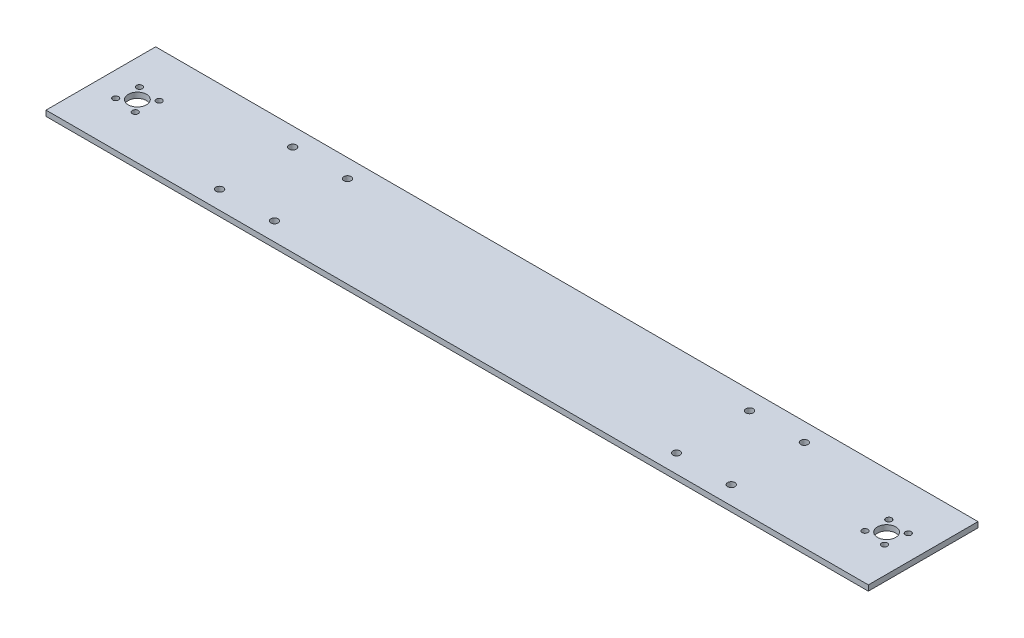
ISO-10303-21;
HEADER;
FILE_DESCRIPTION(('STEP AP214'),'2;1');
FILE_NAME('part.step','',(''),(''),'','','');
FILE_SCHEMA(('AUTOMOTIVE_DESIGN { 1 0 10303 214 1 1 1 1 }'));
ENDSEC;
DATA;
#1=APPLICATION_CONTEXT('core data for automotive mechanical design processes');
#2=APPLICATION_PROTOCOL_DEFINITION('international standard','automotive_design',2000,#1);
#3=PRODUCT_CONTEXT('',#1,'mechanical');
#4=PRODUCT('Part','Part','',(#3));
#5=PRODUCT_RELATED_PRODUCT_CATEGORY('part','',(#4));
#6=PRODUCT_DEFINITION_FORMATION('','',#4);
#7=PRODUCT_DEFINITION_CONTEXT('part definition',#1,'design');
#8=PRODUCT_DEFINITION('design','',#6,#7);
#9=PRODUCT_DEFINITION_SHAPE('','',#8);
#10=(LENGTH_UNIT() NAMED_UNIT(*) SI_UNIT(.MILLI.,.METRE.));
#11=(NAMED_UNIT(*) PLANE_ANGLE_UNIT() SI_UNIT($,.RADIAN.));
#12=(NAMED_UNIT(*) SI_UNIT($,.STERADIAN.) SOLID_ANGLE_UNIT());
#13=UNCERTAINTY_MEASURE_WITH_UNIT(LENGTH_MEASURE(1.E-05),#10,'distance_accuracy_value','');
#14=(GEOMETRIC_REPRESENTATION_CONTEXT(3) GLOBAL_UNCERTAINTY_ASSIGNED_CONTEXT((#13)) GLOBAL_UNIT_ASSIGNED_CONTEXT((#10,
#11,#12)) REPRESENTATION_CONTEXT('',''));
#15=CARTESIAN_POINT('',(0.,0.,0.));
#16=DIRECTION('',(0.,0.,1.));
#17=DIRECTION('',(1.,0.,0.));
#18=AXIS2_PLACEMENT_3D('',#15,#16,#17);
#19=CARTESIAN_POINT('',(0.,3.,0.));
#20=DIRECTION('',(-1.,0.,0.));
#21=DIRECTION('',(0.,0.,1.));
#22=AXIS2_PLACEMENT_3D('',#19,#20,#21);
#23=PLANE('',#22);
#24=DIRECTION('',(0.,0.,-1.));
#25=VECTOR('',#24,1.);
#26=CARTESIAN_POINT('',(0.,0.,0.));
#27=LINE('',#26,#25);
#28=CARTESIAN_POINT('',(0.,0.,0.));
#29=VERTEX_POINT('',#28);
#30=CARTESIAN_POINT('',(0.,0.,-60.));
#31=VERTEX_POINT('',#30);
#32=EDGE_CURVE('E109',#29,#31,#27,.T.);
#33=ORIENTED_EDGE('',*,*,#32,.T.);
#34=DIRECTION('',(0.,-1.,0.));
#35=VECTOR('',#34,1.);
#36=CARTESIAN_POINT('',(0.,3.,-60.));
#37=LINE('',#36,#35);
#38=CARTESIAN_POINT('',(0.,3.,-60.));
#39=VERTEX_POINT('',#38);
#40=EDGE_CURVE('E11',#39,#31,#37,.T.);
#41=ORIENTED_EDGE('',*,*,#40,.F.);
#42=DIRECTION('',(0.,0.,-1.));
#43=VECTOR('',#42,1.);
#44=CARTESIAN_POINT('',(0.,3.,0.));
#45=LINE('',#44,#43);
#46=CARTESIAN_POINT('',(0.,3.,0.));
#47=VERTEX_POINT('',#46);
#48=EDGE_CURVE('E96',#47,#39,#45,.T.);
#49=ORIENTED_EDGE('',*,*,#48,.F.);
#50=DIRECTION('',(0.,-1.,0.));
#51=VECTOR('',#50,1.);
#52=CARTESIAN_POINT('',(0.,3.,0.));
#53=LINE('',#52,#51);
#54=EDGE_CURVE('E105',#47,#29,#53,.T.);
#55=ORIENTED_EDGE('',*,*,#54,.T.);
#56=EDGE_LOOP('',(#33,#41,#49,#55));
#57=FACE_BOUND('',#56,.T.);
#58=ADVANCED_FACE('F43',(#57),#23,.F.);
#59=CARTESIAN_POINT('',(0.,3.,-60.));
#60=DIRECTION('',(0.,0.,1.));
#61=DIRECTION('',(1.,0.,0.));
#62=AXIS2_PLACEMENT_3D('',#59,#60,#61);
#63=PLANE('',#62);
#64=DIRECTION('',(-1.,0.,0.));
#65=VECTOR('',#64,1.);
#66=CARTESIAN_POINT('',(0.,0.,-60.));
#67=LINE('',#66,#65);
#68=CARTESIAN_POINT('',(-450.,0.,-60.));
#69=VERTEX_POINT('',#68);
#70=EDGE_CURVE('E100',#31,#69,#67,.T.);
#71=ORIENTED_EDGE('',*,*,#70,.T.);
#72=DIRECTION('',(0.,-1.,0.));
#73=VECTOR('',#72,1.);
#74=CARTESIAN_POINT('',(-450.,3.,-60.));
#75=LINE('',#74,#73);
#76=CARTESIAN_POINT('',(-450.,3.,-60.));
#77=VERTEX_POINT('',#76);
#78=EDGE_CURVE('E52',#77,#69,#75,.T.);
#79=ORIENTED_EDGE('',*,*,#78,.F.);
#80=DIRECTION('',(-1.,0.,0.));
#81=VECTOR('',#80,1.);
#82=CARTESIAN_POINT('',(0.,3.,-60.));
#83=LINE('',#82,#81);
#84=EDGE_CURVE('E91',#39,#77,#83,.T.);
#85=ORIENTED_EDGE('',*,*,#84,.F.);
#86=ORIENTED_EDGE('',*,*,#40,.T.);
#87=EDGE_LOOP('',(#71,#79,#85,#86));
#88=FACE_BOUND('',#87,.T.);
#89=ADVANCED_FACE('F99',(#88),#63,.F.);
#90=CARTESIAN_POINT('',(-450.,3.,0.));
#91=DIRECTION('',(1.,0.,0.));
#92=DIRECTION('',(0.,0.,-1.));
#93=AXIS2_PLACEMENT_3D('',#90,#91,#92);
#94=PLANE('',#93);
#95=DIRECTION('',(0.,0.,1.));
#96=VECTOR('',#95,1.);
#97=CARTESIAN_POINT('',(-450.,0.,0.));
#98=LINE('',#97,#96);
#99=CARTESIAN_POINT('',(-450.,0.,0.));
#100=VERTEX_POINT('',#99);
#101=EDGE_CURVE('E78',#69,#100,#98,.T.);
#102=ORIENTED_EDGE('',*,*,#101,.T.);
#103=DIRECTION('',(0.,-1.,0.));
#104=VECTOR('',#103,1.);
#105=CARTESIAN_POINT('',(-450.,3.,0.));
#106=LINE('',#105,#104);
#107=CARTESIAN_POINT('',(-450.,3.,0.));
#108=VERTEX_POINT('',#107);
#109=EDGE_CURVE('E101',#108,#100,#106,.T.);
#110=ORIENTED_EDGE('',*,*,#109,.F.);
#111=DIRECTION('',(0.,0.,1.));
#112=VECTOR('',#111,1.);
#113=CARTESIAN_POINT('',(-450.,3.,0.));
#114=LINE('',#113,#112);
#115=EDGE_CURVE('E94',#77,#108,#114,.T.);
#116=ORIENTED_EDGE('',*,*,#115,.F.);
#117=ORIENTED_EDGE('',*,*,#78,.T.);
#118=EDGE_LOOP('',(#102,#110,#116,#117));
#119=FACE_BOUND('',#118,.T.);
#120=ADVANCED_FACE('F103',(#119),#94,.F.);
#121=CARTESIAN_POINT('',(0.,3.,0.));
#122=DIRECTION('',(0.,0.,-1.));
#123=DIRECTION('',(-1.,0.,0.));
#124=AXIS2_PLACEMENT_3D('',#121,#122,#123);
#125=PLANE('',#124);
#126=DIRECTION('',(1.,0.,0.));
#127=VECTOR('',#126,1.);
#128=CARTESIAN_POINT('',(0.,0.,0.));
#129=LINE('',#128,#127);
#130=EDGE_CURVE('E84',#100,#29,#129,.T.);
#131=ORIENTED_EDGE('',*,*,#130,.T.);
#132=ORIENTED_EDGE('',*,*,#54,.F.);
#133=DIRECTION('',(1.,0.,0.));
#134=VECTOR('',#133,1.);
#135=CARTESIAN_POINT('',(0.,3.,0.));
#136=LINE('',#135,#134);
#137=EDGE_CURVE('E61',#108,#47,#136,.T.);
#138=ORIENTED_EDGE('',*,*,#137,.F.);
#139=ORIENTED_EDGE('',*,*,#109,.T.);
#140=EDGE_LOOP('',(#131,#132,#138,#139));
#141=FACE_BOUND('',#140,.T.);
#142=ADVANCED_FACE('F220',(#141),#125,.F.);
#143=CARTESIAN_POINT('',(0.,3.,0.));
#144=DIRECTION('',(0.,1.,0.));
#145=DIRECTION('',(0.,0.,1.));
#146=AXIS2_PLACEMENT_3D('',#143,#144,#145);
#147=PLANE('',#146);
#148=CARTESIAN_POINT('',(-25.3457226439257,3.,-36.5549777485414));
#149=DIRECTION('',(0.,1.,0.));
#150=DIRECTION('',(0.,0.,1.));
#151=AXIS2_PLACEMENT_3D('',#148,#149,#150);
#152=CIRCLE('',#151,1.6);
#153=CARTESIAN_POINT('',(-25.3457226439257,3.,-34.9549777485414));
#154=VERTEX_POINT('',#153);
#155=EDGE_CURVE('E436',#154,#154,#152,.T.);
#156=ORIENTED_EDGE('',*,*,#155,.F.);
#157=EDGE_LOOP('',(#156));
#158=FACE_BOUND('',#157,.T.);
#159=CARTESIAN_POINT('',(-26.5109179084313,3.,-24.6436634580579));
#160=DIRECTION('',(0.,1.,0.));
#161=DIRECTION('',(0.,0.,1.));
#162=AXIS2_PLACEMENT_3D('',#159,#160,#161);
#163=CIRCLE('',#162,1.59999999999998);
#164=CARTESIAN_POINT('',(-26.5109179084313,3.,-23.0436634580579));
#165=VERTEX_POINT('',#164);
#166=EDGE_CURVE('E437',#165,#165,#163,.T.);
#167=ORIENTED_EDGE('',*,*,#166,.F.);
#168=EDGE_LOOP('',(#167));
#169=FACE_BOUND('',#168,.T.);
#170=CARTESIAN_POINT('',(-14.6436634580576,3.,-23.4890820915691));
#171=DIRECTION('',(0.,1.,0.));
#172=DIRECTION('',(0.,0.,1.));
#173=AXIS2_PLACEMENT_3D('',#170,#171,#172);
#174=CIRCLE('',#173,1.6);
#175=CARTESIAN_POINT('',(-14.6436634580576,3.,-21.8890820915691));
#176=VERTEX_POINT('',#175);
#177=EDGE_CURVE('E440',#176,#176,#174,.T.);
#178=ORIENTED_EDGE('',*,*,#177,.F.);
#179=EDGE_LOOP('',(#178));
#180=FACE_BOUND('',#179,.T.);
#181=CARTESIAN_POINT('',(-13.489082091569,3.,-35.3563365419424));
#182=DIRECTION('',(0.,1.,0.));
#183=DIRECTION('',(0.,0.,1.));
#184=AXIS2_PLACEMENT_3D('',#181,#182,#183);
#185=CIRCLE('',#184,1.6);
#186=CARTESIAN_POINT('',(-13.489082091569,3.,-33.7563365419424));
#187=VERTEX_POINT('',#186);
#188=EDGE_CURVE('E130',#187,#187,#185,.T.);
#189=ORIENTED_EDGE('',*,*,#188,.F.);
#190=EDGE_LOOP('',(#189));
#191=FACE_BOUND('',#190,.T.);
#192=CARTESIAN_POINT('',(-423.489082091569,3.,-35.3563365419422));
#193=DIRECTION('',(0.,1.,0.));
#194=DIRECTION('',(0.,0.,1.));
#195=AXIS2_PLACEMENT_3D('',#192,#193,#194);
#196=CIRCLE('',#195,1.59999999999996);
#197=CARTESIAN_POINT('',(-423.489082091569,3.,-33.7563365419422));
#198=VERTEX_POINT('',#197);
#199=EDGE_CURVE('E137',#198,#198,#196,.T.);
#200=ORIENTED_EDGE('',*,*,#199,.F.);
#201=EDGE_LOOP('',(#200));
#202=FACE_BOUND('',#201,.T.);
#203=CARTESIAN_POINT('',(-424.643663458058,3.,-23.489082091569));
#204=DIRECTION('',(0.,1.,0.));
#205=DIRECTION('',(0.,0.,1.));
#206=AXIS2_PLACEMENT_3D('',#203,#204,#205);
#207=CIRCLE('',#206,1.60000000000002);
#208=CARTESIAN_POINT('',(-424.643663458058,3.,-21.8890820915689));
#209=VERTEX_POINT('',#208);
#210=EDGE_CURVE('E146',#209,#209,#207,.T.);
#211=ORIENTED_EDGE('',*,*,#210,.F.);
#212=EDGE_LOOP('',(#211));
#213=FACE_BOUND('',#212,.T.);
#214=CARTESIAN_POINT('',(-436.510917908431,3.,-24.6436634580576));
#215=DIRECTION('',(0.,1.,0.));
#216=DIRECTION('',(0.,0.,1.));
#217=AXIS2_PLACEMENT_3D('',#214,#215,#216);
#218=CIRCLE('',#217,1.60000000000002);
#219=CARTESIAN_POINT('',(-436.510917908431,3.,-23.0436634580576));
#220=VERTEX_POINT('',#219);
#221=EDGE_CURVE('E448',#220,#220,#218,.T.);
#222=ORIENTED_EDGE('',*,*,#221,.F.);
#223=EDGE_LOOP('',(#222));
#224=FACE_BOUND('',#223,.T.);
#225=CARTESIAN_POINT('',(-435.356336541942,3.,-36.510917908431));
#226=DIRECTION('',(0.,1.,0.));
#227=DIRECTION('',(0.,0.,1.));
#228=AXIS2_PLACEMENT_3D('',#225,#226,#227);
#229=CIRCLE('',#228,1.59999999999996);
#230=CARTESIAN_POINT('',(-435.356336541942,3.,-34.910917908431));
#231=VERTEX_POINT('',#230);
#232=EDGE_CURVE('E154',#231,#231,#229,.T.);
#233=ORIENTED_EDGE('',*,*,#232,.F.);
#234=EDGE_LOOP('',(#233));
#235=FACE_BOUND('',#234,.T.);
#236=CARTESIAN_POINT('',(-20.,3.,-30.));
#237=DIRECTION('',(0.,1.,0.));
#238=DIRECTION('',(0.,0.,1.));
#239=AXIS2_PLACEMENT_3D('',#236,#237,#238);
#240=CIRCLE('',#239,5.);
#241=CARTESIAN_POINT('',(-20.,3.,-25.));
#242=VERTEX_POINT('',#241);
#243=EDGE_CURVE('E122',#242,#242,#240,.T.);
#244=ORIENTED_EDGE('',*,*,#243,.F.);
#245=EDGE_LOOP('',(#244));
#246=FACE_BOUND('',#245,.T.);
#247=CARTESIAN_POINT('',(-430.,3.,-30.));
#248=DIRECTION('',(0.,1.,0.));
#249=DIRECTION('',(0.,0.,1.));
#250=AXIS2_PLACEMENT_3D('',#247,#248,#249);
#251=CIRCLE('',#250,4.99999999999999);
#252=CARTESIAN_POINT('',(-430.,3.,-25.));
#253=VERTEX_POINT('',#252);
#254=EDGE_CURVE('E153',#253,#253,#251,.T.);
#255=ORIENTED_EDGE('',*,*,#254,.F.);
#256=EDGE_LOOP('',(#255));
#257=FACE_BOUND('',#256,.T.);
#258=CARTESIAN_POINT('',(-365.,3.,-50.));
#259=DIRECTION('',(0.,1.,0.));
#260=DIRECTION('',(0.,0.,1.));
#261=AXIS2_PLACEMENT_3D('',#258,#259,#260);
#262=CIRCLE('',#261,2.);
#263=CARTESIAN_POINT('',(-365.,3.,-48.));
#264=VERTEX_POINT('',#263);
#265=EDGE_CURVE('E125',#264,#264,#262,.T.);
#266=ORIENTED_EDGE('',*,*,#265,.F.);
#267=EDGE_LOOP('',(#266));
#268=FACE_BOUND('',#267,.T.);
#269=CARTESIAN_POINT('',(-335.,3.,-50.));
#270=DIRECTION('',(0.,1.,0.));
#271=DIRECTION('',(0.,0.,1.));
#272=AXIS2_PLACEMENT_3D('',#269,#270,#271);
#273=CIRCLE('',#272,2.);
#274=CARTESIAN_POINT('',(-335.,3.,-48.));
#275=VERTEX_POINT('',#274);
#276=EDGE_CURVE('E167',#275,#275,#273,.T.);
#277=ORIENTED_EDGE('',*,*,#276,.F.);
#278=EDGE_LOOP('',(#277));
#279=FACE_BOUND('',#278,.T.);
#280=CARTESIAN_POINT('',(-365.,3.,-9.99999999999995));
#281=DIRECTION('',(0.,1.,0.));
#282=DIRECTION('',(0.,0.,1.));
#283=AXIS2_PLACEMENT_3D('',#280,#281,#282);
#284=CIRCLE('',#283,2.);
#285=CARTESIAN_POINT('',(-365.,3.,-7.99999999999995));
#286=VERTEX_POINT('',#285);
#287=EDGE_CURVE('E173',#286,#286,#284,.T.);
#288=ORIENTED_EDGE('',*,*,#287,.F.);
#289=EDGE_LOOP('',(#288));
#290=FACE_BOUND('',#289,.T.);
#291=CARTESIAN_POINT('',(-335.,3.,-9.99999999999995));
#292=DIRECTION('',(0.,1.,0.));
#293=DIRECTION('',(0.,0.,1.));
#294=AXIS2_PLACEMENT_3D('',#291,#292,#293);
#295=CIRCLE('',#294,2.);
#296=CARTESIAN_POINT('',(-335.,3.,-7.99999999999995));
#297=VERTEX_POINT('',#296);
#298=EDGE_CURVE('E179',#297,#297,#295,.T.);
#299=ORIENTED_EDGE('',*,*,#298,.F.);
#300=EDGE_LOOP('',(#299));
#301=FACE_BOUND('',#300,.T.);
#302=CARTESIAN_POINT('',(-115.,3.,-50.));
#303=DIRECTION('',(0.,1.,0.));
#304=DIRECTION('',(0.,0.,1.));
#305=AXIS2_PLACEMENT_3D('',#302,#303,#304);
#306=CIRCLE('',#305,1.99999999999999);
#307=CARTESIAN_POINT('',(-115.,3.,-48.));
#308=VERTEX_POINT('',#307);
#309=EDGE_CURVE('E185',#308,#308,#306,.T.);
#310=ORIENTED_EDGE('',*,*,#309,.F.);
#311=EDGE_LOOP('',(#310));
#312=FACE_BOUND('',#311,.T.);
#313=CARTESIAN_POINT('',(-85.,3.,-50.));
#314=DIRECTION('',(0.,1.,0.));
#315=DIRECTION('',(0.,0.,1.));
#316=AXIS2_PLACEMENT_3D('',#313,#314,#315);
#317=CIRCLE('',#316,1.99999999999999);
#318=CARTESIAN_POINT('',(-85.,3.,-48.));
#319=VERTEX_POINT('',#318);
#320=EDGE_CURVE('E191',#319,#319,#317,.T.);
#321=ORIENTED_EDGE('',*,*,#320,.F.);
#322=EDGE_LOOP('',(#321));
#323=FACE_BOUND('',#322,.T.);
#324=CARTESIAN_POINT('',(-115.,3.,-9.99999999999995));
#325=DIRECTION('',(0.,1.,0.));
#326=DIRECTION('',(0.,0.,1.));
#327=AXIS2_PLACEMENT_3D('',#324,#325,#326);
#328=CIRCLE('',#327,1.99999999999999);
#329=CARTESIAN_POINT('',(-115.,3.,-7.99999999999996));
#330=VERTEX_POINT('',#329);
#331=EDGE_CURVE('E197',#330,#330,#328,.T.);
#332=ORIENTED_EDGE('',*,*,#331,.F.);
#333=EDGE_LOOP('',(#332));
#334=FACE_BOUND('',#333,.T.);
#335=CARTESIAN_POINT('',(-85.,3.,-9.99999999999995));
#336=DIRECTION('',(0.,1.,0.));
#337=DIRECTION('',(0.,0.,1.));
#338=AXIS2_PLACEMENT_3D('',#335,#336,#337);
#339=CIRCLE('',#338,1.99999999999999);
#340=CARTESIAN_POINT('',(-85.,3.,-7.99999999999996));
#341=VERTEX_POINT('',#340);
#342=EDGE_CURVE('E203',#341,#341,#339,.T.);
#343=ORIENTED_EDGE('',*,*,#342,.F.);
#344=EDGE_LOOP('',(#343));
#345=FACE_BOUND('',#344,.T.);
#346=ORIENTED_EDGE('',*,*,#48,.T.);
#347=ORIENTED_EDGE('',*,*,#84,.T.);
#348=ORIENTED_EDGE('',*,*,#115,.T.);
#349=ORIENTED_EDGE('',*,*,#137,.T.);
#350=EDGE_LOOP('',(#346,#347,#348,#349));
#351=FACE_BOUND('',#350,.T.);
#352=ADVANCED_FACE('F92',(#158,#169,#180,#191,#202,#213,#224,#235,#246,#257,#268,#279,#290,#301,
#312,#323,#334,#345,#351),#147,.T.);
#353=CARTESIAN_POINT('',(0.,0.,0.));
#354=DIRECTION('',(0.,1.,0.));
#355=DIRECTION('',(0.,0.,1.));
#356=AXIS2_PLACEMENT_3D('',#353,#354,#355);
#357=PLANE('',#356);
#358=CARTESIAN_POINT('',(-25.3457226439257,0.,-36.5549777485414));
#359=DIRECTION('',(0.,1.,0.));
#360=DIRECTION('',(0.,0.,1.));
#361=AXIS2_PLACEMENT_3D('',#358,#359,#360);
#362=CIRCLE('',#361,1.6);
#363=CARTESIAN_POINT('',(-25.3457226439257,0.,-34.9549777485414));
#364=VERTEX_POINT('',#363);
#365=EDGE_CURVE('E46',#364,#364,#362,.T.);
#366=ORIENTED_EDGE('',*,*,#365,.T.);
#367=EDGE_LOOP('',(#366));
#368=FACE_BOUND('',#367,.T.);
#369=CARTESIAN_POINT('',(-26.5109179084313,0.,-24.6436634580579));
#370=DIRECTION('',(0.,1.,0.));
#371=DIRECTION('',(0.,0.,1.));
#372=AXIS2_PLACEMENT_3D('',#369,#370,#371);
#373=CIRCLE('',#372,1.59999999999998);
#374=CARTESIAN_POINT('',(-26.5109179084313,0.,-23.0436634580579));
#375=VERTEX_POINT('',#374);
#376=EDGE_CURVE('E132',#375,#375,#373,.T.);
#377=ORIENTED_EDGE('',*,*,#376,.T.);
#378=EDGE_LOOP('',(#377));
#379=FACE_BOUND('',#378,.T.);
#380=CARTESIAN_POINT('',(-14.6436634580576,0.,-23.4890820915691));
#381=DIRECTION('',(0.,1.,0.));
#382=DIRECTION('',(0.,0.,1.));
#383=AXIS2_PLACEMENT_3D('',#380,#381,#382);
#384=CIRCLE('',#383,1.6);
#385=CARTESIAN_POINT('',(-14.6436634580576,0.,-21.8890820915691));
#386=VERTEX_POINT('',#385);
#387=EDGE_CURVE('E129',#386,#386,#384,.T.);
#388=ORIENTED_EDGE('',*,*,#387,.T.);
#389=EDGE_LOOP('',(#388));
#390=FACE_BOUND('',#389,.T.);
#391=CARTESIAN_POINT('',(-13.489082091569,0.,-35.3563365419424));
#392=DIRECTION('',(0.,1.,0.));
#393=DIRECTION('',(0.,0.,1.));
#394=AXIS2_PLACEMENT_3D('',#391,#392,#393);
#395=CIRCLE('',#394,1.6);
#396=CARTESIAN_POINT('',(-13.489082091569,0.,-33.7563365419424));
#397=VERTEX_POINT('',#396);
#398=EDGE_CURVE('E126',#397,#397,#395,.T.);
#399=ORIENTED_EDGE('',*,*,#398,.T.);
#400=EDGE_LOOP('',(#399));
#401=FACE_BOUND('',#400,.T.);
#402=CARTESIAN_POINT('',(-423.489082091569,0.,-35.3563365419422));
#403=DIRECTION('',(0.,1.,0.));
#404=DIRECTION('',(0.,0.,1.));
#405=AXIS2_PLACEMENT_3D('',#402,#403,#404);
#406=CIRCLE('',#405,1.59999999999996);
#407=CARTESIAN_POINT('',(-423.489082091569,0.,-33.7563365419422));
#408=VERTEX_POINT('',#407);
#409=EDGE_CURVE('E141',#408,#408,#406,.T.);
#410=ORIENTED_EDGE('',*,*,#409,.T.);
#411=EDGE_LOOP('',(#410));
#412=FACE_BOUND('',#411,.T.);
#413=CARTESIAN_POINT('',(-424.643663458058,0.,-23.489082091569));
#414=DIRECTION('',(0.,1.,0.));
#415=DIRECTION('',(0.,0.,1.));
#416=AXIS2_PLACEMENT_3D('',#413,#414,#415);
#417=CIRCLE('',#416,1.60000000000002);
#418=CARTESIAN_POINT('',(-424.643663458058,0.,-21.8890820915689));
#419=VERTEX_POINT('',#418);
#420=EDGE_CURVE('E451',#419,#419,#417,.T.);
#421=ORIENTED_EDGE('',*,*,#420,.T.);
#422=EDGE_LOOP('',(#421));
#423=FACE_BOUND('',#422,.T.);
#424=CARTESIAN_POINT('',(-436.510917908431,0.,-24.6436634580576));
#425=DIRECTION('',(0.,1.,0.));
#426=DIRECTION('',(0.,0.,1.));
#427=AXIS2_PLACEMENT_3D('',#424,#425,#426);
#428=CIRCLE('',#427,1.60000000000002);
#429=CARTESIAN_POINT('',(-436.510917908431,0.,-23.0436634580576));
#430=VERTEX_POINT('',#429);
#431=EDGE_CURVE('E157',#430,#430,#428,.T.);
#432=ORIENTED_EDGE('',*,*,#431,.T.);
#433=EDGE_LOOP('',(#432));
#434=FACE_BOUND('',#433,.T.);
#435=CARTESIAN_POINT('',(-435.356336541942,0.,-36.510917908431));
#436=DIRECTION('',(0.,1.,0.));
#437=DIRECTION('',(0.,0.,1.));
#438=AXIS2_PLACEMENT_3D('',#435,#436,#437);
#439=CIRCLE('',#438,1.59999999999996);
#440=CARTESIAN_POINT('',(-435.356336541942,0.,-34.910917908431));
#441=VERTEX_POINT('',#440);
#442=EDGE_CURVE('E150',#441,#441,#439,.T.);
#443=ORIENTED_EDGE('',*,*,#442,.T.);
#444=EDGE_LOOP('',(#443));
#445=FACE_BOUND('',#444,.T.);
#446=CARTESIAN_POINT('',(-20.,0.,-30.));
#447=DIRECTION('',(0.,1.,0.));
#448=DIRECTION('',(0.,0.,1.));
#449=AXIS2_PLACEMENT_3D('',#446,#447,#448);
#450=CIRCLE('',#449,5.);
#451=CARTESIAN_POINT('',(-20.,0.,-25.));
#452=VERTEX_POINT('',#451);
#453=EDGE_CURVE('E121',#452,#452,#450,.T.);
#454=ORIENTED_EDGE('',*,*,#453,.T.);
#455=EDGE_LOOP('',(#454));
#456=FACE_BOUND('',#455,.T.);
#457=CARTESIAN_POINT('',(-430.,0.,-30.));
#458=DIRECTION('',(0.,1.,0.));
#459=DIRECTION('',(0.,0.,1.));
#460=AXIS2_PLACEMENT_3D('',#457,#458,#459);
#461=CIRCLE('',#460,4.99999999999999);
#462=CARTESIAN_POINT('',(-430.,0.,-25.));
#463=VERTEX_POINT('',#462);
#464=EDGE_CURVE('E118',#463,#463,#461,.T.);
#465=ORIENTED_EDGE('',*,*,#464,.T.);
#466=EDGE_LOOP('',(#465));
#467=FACE_BOUND('',#466,.T.);
#468=CARTESIAN_POINT('',(-365.,0.,-50.));
#469=DIRECTION('',(0.,1.,0.));
#470=DIRECTION('',(0.,0.,1.));
#471=AXIS2_PLACEMENT_3D('',#468,#469,#470);
#472=CIRCLE('',#471,2.);
#473=CARTESIAN_POINT('',(-365.,0.,-48.));
#474=VERTEX_POINT('',#473);
#475=EDGE_CURVE('E164',#474,#474,#472,.T.);
#476=ORIENTED_EDGE('',*,*,#475,.T.);
#477=EDGE_LOOP('',(#476));
#478=FACE_BOUND('',#477,.T.);
#479=CARTESIAN_POINT('',(-335.,0.,-50.));
#480=DIRECTION('',(0.,1.,0.));
#481=DIRECTION('',(0.,0.,1.));
#482=AXIS2_PLACEMENT_3D('',#479,#480,#481);
#483=CIRCLE('',#482,2.);
#484=CARTESIAN_POINT('',(-335.,0.,-48.));
#485=VERTEX_POINT('',#484);
#486=EDGE_CURVE('E170',#485,#485,#483,.T.);
#487=ORIENTED_EDGE('',*,*,#486,.T.);
#488=EDGE_LOOP('',(#487));
#489=FACE_BOUND('',#488,.T.);
#490=CARTESIAN_POINT('',(-365.,0.,-9.99999999999995));
#491=DIRECTION('',(0.,1.,0.));
#492=DIRECTION('',(0.,0.,1.));
#493=AXIS2_PLACEMENT_3D('',#490,#491,#492);
#494=CIRCLE('',#493,2.);
#495=CARTESIAN_POINT('',(-365.,0.,-7.99999999999995));
#496=VERTEX_POINT('',#495);
#497=EDGE_CURVE('E176',#496,#496,#494,.T.);
#498=ORIENTED_EDGE('',*,*,#497,.T.);
#499=EDGE_LOOP('',(#498));
#500=FACE_BOUND('',#499,.T.);
#501=CARTESIAN_POINT('',(-335.,0.,-9.99999999999995));
#502=DIRECTION('',(0.,1.,0.));
#503=DIRECTION('',(0.,0.,1.));
#504=AXIS2_PLACEMENT_3D('',#501,#502,#503);
#505=CIRCLE('',#504,2.);
#506=CARTESIAN_POINT('',(-335.,0.,-7.99999999999995));
#507=VERTEX_POINT('',#506);
#508=EDGE_CURVE('E182',#507,#507,#505,.T.);
#509=ORIENTED_EDGE('',*,*,#508,.T.);
#510=EDGE_LOOP('',(#509));
#511=FACE_BOUND('',#510,.T.);
#512=CARTESIAN_POINT('',(-115.,0.,-50.));
#513=DIRECTION('',(0.,1.,0.));
#514=DIRECTION('',(0.,0.,1.));
#515=AXIS2_PLACEMENT_3D('',#512,#513,#514);
#516=CIRCLE('',#515,1.99999999999999);
#517=CARTESIAN_POINT('',(-115.,0.,-48.));
#518=VERTEX_POINT('',#517);
#519=EDGE_CURVE('E188',#518,#518,#516,.T.);
#520=ORIENTED_EDGE('',*,*,#519,.T.);
#521=EDGE_LOOP('',(#520));
#522=FACE_BOUND('',#521,.T.);
#523=CARTESIAN_POINT('',(-85.,0.,-50.));
#524=DIRECTION('',(0.,1.,0.));
#525=DIRECTION('',(0.,0.,1.));
#526=AXIS2_PLACEMENT_3D('',#523,#524,#525);
#527=CIRCLE('',#526,1.99999999999999);
#528=CARTESIAN_POINT('',(-85.,0.,-48.));
#529=VERTEX_POINT('',#528);
#530=EDGE_CURVE('E194',#529,#529,#527,.T.);
#531=ORIENTED_EDGE('',*,*,#530,.T.);
#532=EDGE_LOOP('',(#531));
#533=FACE_BOUND('',#532,.T.);
#534=CARTESIAN_POINT('',(-115.,0.,-9.99999999999995));
#535=DIRECTION('',(0.,1.,0.));
#536=DIRECTION('',(0.,0.,1.));
#537=AXIS2_PLACEMENT_3D('',#534,#535,#536);
#538=CIRCLE('',#537,1.99999999999999);
#539=CARTESIAN_POINT('',(-115.,0.,-7.99999999999996));
#540=VERTEX_POINT('',#539);
#541=EDGE_CURVE('E200',#540,#540,#538,.T.);
#542=ORIENTED_EDGE('',*,*,#541,.T.);
#543=EDGE_LOOP('',(#542));
#544=FACE_BOUND('',#543,.T.);
#545=CARTESIAN_POINT('',(-85.,0.,-9.99999999999995));
#546=DIRECTION('',(0.,1.,0.));
#547=DIRECTION('',(0.,0.,1.));
#548=AXIS2_PLACEMENT_3D('',#545,#546,#547);
#549=CIRCLE('',#548,1.99999999999999);
#550=CARTESIAN_POINT('',(-85.,0.,-7.99999999999996));
#551=VERTEX_POINT('',#550);
#552=EDGE_CURVE('E112',#551,#551,#549,.T.);
#553=ORIENTED_EDGE('',*,*,#552,.T.);
#554=EDGE_LOOP('',(#553));
#555=FACE_BOUND('',#554,.T.);
#556=ORIENTED_EDGE('',*,*,#32,.F.);
#557=ORIENTED_EDGE('',*,*,#130,.F.);
#558=ORIENTED_EDGE('',*,*,#101,.F.);
#559=ORIENTED_EDGE('',*,*,#70,.F.);
#560=EDGE_LOOP('',(#556,#557,#558,#559));
#561=FACE_BOUND('',#560,.T.);
#562=ADVANCED_FACE('F209',(#368,#379,#390,#401,#412,#423,#434,#445,#456,#467,#478,#489,#500,
#511,#522,#533,#544,#555,#561),#357,.F.);
#563=CARTESIAN_POINT('',(-85.,3.,-9.99999999999995));
#564=DIRECTION('',(0.,1.,0.));
#565=DIRECTION('',(0.,0.,1.));
#566=AXIS2_PLACEMENT_3D('',#563,#564,#565);
#567=CYLINDRICAL_SURFACE('',#566,1.99999999999999);
#568=ORIENTED_EDGE('',*,*,#552,.F.);
#569=EDGE_LOOP('',(#568));
#570=FACE_BOUND('',#569,.T.);
#571=ORIENTED_EDGE('',*,*,#342,.T.);
#572=EDGE_LOOP('',(#571));
#573=FACE_BOUND('',#572,.T.);
#574=ADVANCED_FACE('F212',(#570,#573),#567,.F.);
#575=CARTESIAN_POINT('',(-115.,3.,-9.99999999999995));
#576=DIRECTION('',(0.,1.,0.));
#577=DIRECTION('',(0.,0.,1.));
#578=AXIS2_PLACEMENT_3D('',#575,#576,#577);
#579=CYLINDRICAL_SURFACE('',#578,1.99999999999999);
#580=ORIENTED_EDGE('',*,*,#541,.F.);
#581=EDGE_LOOP('',(#580));
#582=FACE_BOUND('',#581,.T.);
#583=ORIENTED_EDGE('',*,*,#331,.T.);
#584=EDGE_LOOP('',(#583));
#585=FACE_BOUND('',#584,.T.);
#586=ADVANCED_FACE('F215',(#582,#585),#579,.F.);
#587=CARTESIAN_POINT('',(-85.,3.,-50.));
#588=DIRECTION('',(0.,1.,0.));
#589=DIRECTION('',(0.,0.,1.));
#590=AXIS2_PLACEMENT_3D('',#587,#588,#589);
#591=CYLINDRICAL_SURFACE('',#590,1.99999999999999);
#592=ORIENTED_EDGE('',*,*,#530,.F.);
#593=EDGE_LOOP('',(#592));
#594=FACE_BOUND('',#593,.T.);
#595=ORIENTED_EDGE('',*,*,#320,.T.);
#596=EDGE_LOOP('',(#595));
#597=FACE_BOUND('',#596,.T.);
#598=ADVANCED_FACE('F269',(#594,#597),#591,.F.);
#599=CARTESIAN_POINT('',(-115.,3.,-50.));
#600=DIRECTION('',(0.,1.,0.));
#601=DIRECTION('',(0.,0.,1.));
#602=AXIS2_PLACEMENT_3D('',#599,#600,#601);
#603=CYLINDRICAL_SURFACE('',#602,1.99999999999999);
#604=ORIENTED_EDGE('',*,*,#519,.F.);
#605=EDGE_LOOP('',(#604));
#606=FACE_BOUND('',#605,.T.);
#607=ORIENTED_EDGE('',*,*,#309,.T.);
#608=EDGE_LOOP('',(#607));
#609=FACE_BOUND('',#608,.T.);
#610=ADVANCED_FACE('F277',(#606,#609),#603,.F.);
#611=CARTESIAN_POINT('',(-335.,3.,-9.99999999999995));
#612=DIRECTION('',(0.,1.,0.));
#613=DIRECTION('',(0.,0.,1.));
#614=AXIS2_PLACEMENT_3D('',#611,#612,#613);
#615=CYLINDRICAL_SURFACE('',#614,2.);
#616=ORIENTED_EDGE('',*,*,#508,.F.);
#617=EDGE_LOOP('',(#616));
#618=FACE_BOUND('',#617,.T.);
#619=ORIENTED_EDGE('',*,*,#298,.T.);
#620=EDGE_LOOP('',(#619));
#621=FACE_BOUND('',#620,.T.);
#622=ADVANCED_FACE('F285',(#618,#621),#615,.F.);
#623=CARTESIAN_POINT('',(-365.,3.,-9.99999999999995));
#624=DIRECTION('',(0.,1.,0.));
#625=DIRECTION('',(0.,0.,1.));
#626=AXIS2_PLACEMENT_3D('',#623,#624,#625);
#627=CYLINDRICAL_SURFACE('',#626,2.);
#628=ORIENTED_EDGE('',*,*,#497,.F.);
#629=EDGE_LOOP('',(#628));
#630=FACE_BOUND('',#629,.T.);
#631=ORIENTED_EDGE('',*,*,#287,.T.);
#632=EDGE_LOOP('',(#631));
#633=FACE_BOUND('',#632,.T.);
#634=ADVANCED_FACE('F293',(#630,#633),#627,.F.);
#635=CARTESIAN_POINT('',(-335.,3.,-50.));
#636=DIRECTION('',(0.,1.,0.));
#637=DIRECTION('',(0.,0.,1.));
#638=AXIS2_PLACEMENT_3D('',#635,#636,#637);
#639=CYLINDRICAL_SURFACE('',#638,2.);
#640=ORIENTED_EDGE('',*,*,#486,.F.);
#641=EDGE_LOOP('',(#640));
#642=FACE_BOUND('',#641,.T.);
#643=ORIENTED_EDGE('',*,*,#276,.T.);
#644=EDGE_LOOP('',(#643));
#645=FACE_BOUND('',#644,.T.);
#646=ADVANCED_FACE('F301',(#642,#645),#639,.F.);
#647=CARTESIAN_POINT('',(-365.,3.,-50.));
#648=DIRECTION('',(0.,1.,0.));
#649=DIRECTION('',(0.,0.,1.));
#650=AXIS2_PLACEMENT_3D('',#647,#648,#649);
#651=CYLINDRICAL_SURFACE('',#650,2.);
#652=ORIENTED_EDGE('',*,*,#475,.F.);
#653=EDGE_LOOP('',(#652));
#654=FACE_BOUND('',#653,.T.);
#655=ORIENTED_EDGE('',*,*,#265,.T.);
#656=EDGE_LOOP('',(#655));
#657=FACE_BOUND('',#656,.T.);
#658=ADVANCED_FACE('F309',(#654,#657),#651,.F.);
#659=CARTESIAN_POINT('',(-430.,-7.,-30.));
#660=DIRECTION('',(0.,1.,0.));
#661=DIRECTION('',(0.,0.,1.));
#662=AXIS2_PLACEMENT_3D('',#659,#660,#661);
#663=CYLINDRICAL_SURFACE('',#662,4.99999999999999);
#664=ORIENTED_EDGE('',*,*,#254,.T.);
#665=EDGE_LOOP('',(#664));
#666=FACE_BOUND('',#665,.T.);
#667=ORIENTED_EDGE('',*,*,#464,.F.);
#668=EDGE_LOOP('',(#667));
#669=FACE_BOUND('',#668,.T.);
#670=ADVANCED_FACE('F317',(#666,#669),#663,.F.);
#671=CARTESIAN_POINT('',(-20.,-7.,-30.));
#672=DIRECTION('',(0.,1.,0.));
#673=DIRECTION('',(0.,0.,1.));
#674=AXIS2_PLACEMENT_3D('',#671,#672,#673);
#675=CYLINDRICAL_SURFACE('',#674,5.);
#676=ORIENTED_EDGE('',*,*,#243,.T.);
#677=EDGE_LOOP('',(#676));
#678=FACE_BOUND('',#677,.T.);
#679=ORIENTED_EDGE('',*,*,#453,.F.);
#680=EDGE_LOOP('',(#679));
#681=FACE_BOUND('',#680,.T.);
#682=ADVANCED_FACE('F325',(#678,#681),#675,.F.);
#683=CARTESIAN_POINT('',(-435.356336541942,0.,-36.510917908431));
#684=DIRECTION('',(0.,1.,0.));
#685=DIRECTION('',(0.,0.,1.));
#686=AXIS2_PLACEMENT_3D('',#683,#684,#685);
#687=CYLINDRICAL_SURFACE('',#686,1.59999999999996);
#688=ORIENTED_EDGE('',*,*,#442,.F.);
#689=EDGE_LOOP('',(#688));
#690=FACE_BOUND('',#689,.T.);
#691=ORIENTED_EDGE('',*,*,#232,.T.);
#692=EDGE_LOOP('',(#691));
#693=FACE_BOUND('',#692,.T.);
#694=ADVANCED_FACE('F333',(#690,#693),#687,.F.);
#695=CARTESIAN_POINT('',(-436.510917908431,0.,-24.6436634580576));
#696=DIRECTION('',(0.,1.,0.));
#697=DIRECTION('',(0.,0.,1.));
#698=AXIS2_PLACEMENT_3D('',#695,#696,#697);
#699=CYLINDRICAL_SURFACE('',#698,1.60000000000002);
#700=ORIENTED_EDGE('',*,*,#431,.F.);
#701=EDGE_LOOP('',(#700));
#702=FACE_BOUND('',#701,.T.);
#703=ORIENTED_EDGE('',*,*,#221,.T.);
#704=EDGE_LOOP('',(#703));
#705=FACE_BOUND('',#704,.T.);
#706=ADVANCED_FACE('F341',(#702,#705),#699,.F.);
#707=CARTESIAN_POINT('',(-424.643663458058,0.,-23.489082091569));
#708=DIRECTION('',(0.,1.,0.));
#709=DIRECTION('',(0.,0.,1.));
#710=AXIS2_PLACEMENT_3D('',#707,#708,#709);
#711=CYLINDRICAL_SURFACE('',#710,1.60000000000002);
#712=ORIENTED_EDGE('',*,*,#420,.F.);
#713=EDGE_LOOP('',(#712));
#714=FACE_BOUND('',#713,.T.);
#715=ORIENTED_EDGE('',*,*,#210,.T.);
#716=EDGE_LOOP('',(#715));
#717=FACE_BOUND('',#716,.T.);
#718=ADVANCED_FACE('F349',(#714,#717),#711,.F.);
#719=CARTESIAN_POINT('',(-423.489082091569,0.,-35.3563365419422));
#720=DIRECTION('',(0.,1.,0.));
#721=DIRECTION('',(0.,0.,1.));
#722=AXIS2_PLACEMENT_3D('',#719,#720,#721);
#723=CYLINDRICAL_SURFACE('',#722,1.59999999999996);
#724=ORIENTED_EDGE('',*,*,#409,.F.);
#725=EDGE_LOOP('',(#724));
#726=FACE_BOUND('',#725,.T.);
#727=ORIENTED_EDGE('',*,*,#199,.T.);
#728=EDGE_LOOP('',(#727));
#729=FACE_BOUND('',#728,.T.);
#730=ADVANCED_FACE('F357',(#726,#729),#723,.F.);
#731=CARTESIAN_POINT('',(-13.489082091569,-7.,-35.3563365419424));
#732=DIRECTION('',(0.,1.,0.));
#733=DIRECTION('',(0.,0.,1.));
#734=AXIS2_PLACEMENT_3D('',#731,#732,#733);
#735=CYLINDRICAL_SURFACE('',#734,1.6);
#736=ORIENTED_EDGE('',*,*,#188,.T.);
#737=EDGE_LOOP('',(#736));
#738=FACE_BOUND('',#737,.T.);
#739=ORIENTED_EDGE('',*,*,#398,.F.);
#740=EDGE_LOOP('',(#739));
#741=FACE_BOUND('',#740,.T.);
#742=ADVANCED_FACE('F364',(#738,#741),#735,.F.);
#743=CARTESIAN_POINT('',(-14.6436634580576,-7.,-23.4890820915691));
#744=DIRECTION('',(0.,1.,0.));
#745=DIRECTION('',(0.,0.,1.));
#746=AXIS2_PLACEMENT_3D('',#743,#744,#745);
#747=CYLINDRICAL_SURFACE('',#746,1.6);
#748=ORIENTED_EDGE('',*,*,#177,.T.);
#749=EDGE_LOOP('',(#748));
#750=FACE_BOUND('',#749,.T.);
#751=ORIENTED_EDGE('',*,*,#387,.F.);
#752=EDGE_LOOP('',(#751));
#753=FACE_BOUND('',#752,.T.);
#754=ADVANCED_FACE('F371',(#750,#753),#747,.F.);
#755=CARTESIAN_POINT('',(-26.5109179084313,-7.,-24.6436634580579));
#756=DIRECTION('',(0.,1.,0.));
#757=DIRECTION('',(0.,0.,1.));
#758=AXIS2_PLACEMENT_3D('',#755,#756,#757);
#759=CYLINDRICAL_SURFACE('',#758,1.59999999999998);
#760=ORIENTED_EDGE('',*,*,#166,.T.);
#761=EDGE_LOOP('',(#760));
#762=FACE_BOUND('',#761,.T.);
#763=ORIENTED_EDGE('',*,*,#376,.F.);
#764=EDGE_LOOP('',(#763));
#765=FACE_BOUND('',#764,.T.);
#766=ADVANCED_FACE('F379',(#762,#765),#759,.F.);
#767=CARTESIAN_POINT('',(-25.3457226439257,-7.,-36.5549777485414));
#768=DIRECTION('',(0.,1.,0.));
#769=DIRECTION('',(0.,0.,1.));
#770=AXIS2_PLACEMENT_3D('',#767,#768,#769);
#771=CYLINDRICAL_SURFACE('',#770,1.6);
#772=ORIENTED_EDGE('',*,*,#155,.T.);
#773=EDGE_LOOP('',(#772));
#774=FACE_BOUND('',#773,.T.);
#775=ORIENTED_EDGE('',*,*,#365,.F.);
#776=EDGE_LOOP('',(#775));
#777=FACE_BOUND('',#776,.T.);
#778=ADVANCED_FACE('F387',(#774,#777),#771,.F.);
#779=CLOSED_SHELL('',(#58,#89,#120,#142,#352,#562,#574,#586,#598,#610,#622,#634,#646,#658,#670,
#682,#694,#706,#718,#730,#742,#754,#766,#778));
#780=MANIFOLD_SOLID_BREP('B2',#779);
#781=ADVANCED_BREP_SHAPE_REPRESENTATION('',(#18,#780),#14);
#782=SHAPE_DEFINITION_REPRESENTATION(#9,#781);
ENDSEC;
END-ISO-10303-21;
